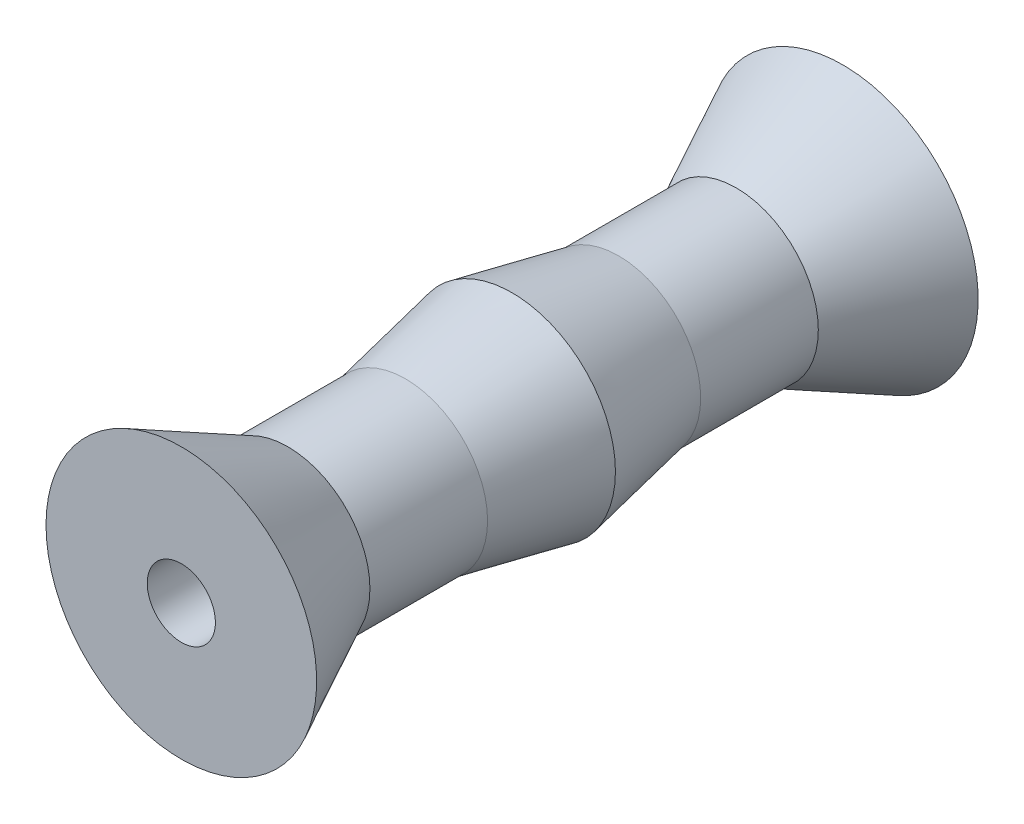
ISO-10303-21;
HEADER;
FILE_DESCRIPTION(('STEP AP214'),'2;1');
FILE_NAME('part.step','',(''),(''),'','','');
FILE_SCHEMA(('AUTOMOTIVE_DESIGN { 1 0 10303 214 1 1 1 1 }'));
ENDSEC;
DATA;
#1=APPLICATION_CONTEXT('core data for automotive mechanical design processes');
#2=APPLICATION_PROTOCOL_DEFINITION('international standard','automotive_design',2000,#1);
#3=PRODUCT_CONTEXT('',#1,'mechanical');
#4=PRODUCT('Part','Part','',(#3));
#5=PRODUCT_RELATED_PRODUCT_CATEGORY('part','',(#4));
#6=PRODUCT_DEFINITION_FORMATION('','',#4);
#7=PRODUCT_DEFINITION_CONTEXT('part definition',#1,'design');
#8=PRODUCT_DEFINITION('design','',#6,#7);
#9=PRODUCT_DEFINITION_SHAPE('','',#8);
#10=(LENGTH_UNIT() NAMED_UNIT(*) SI_UNIT(.MILLI.,.METRE.));
#11=(NAMED_UNIT(*) PLANE_ANGLE_UNIT() SI_UNIT($,.RADIAN.));
#12=(NAMED_UNIT(*) SI_UNIT($,.STERADIAN.) SOLID_ANGLE_UNIT());
#13=UNCERTAINTY_MEASURE_WITH_UNIT(LENGTH_MEASURE(1.E-05),#10,'distance_accuracy_value','');
#14=(GEOMETRIC_REPRESENTATION_CONTEXT(3) GLOBAL_UNCERTAINTY_ASSIGNED_CONTEXT((#13)) GLOBAL_UNIT_ASSIGNED_CONTEXT((#10,
#11,#12)) REPRESENTATION_CONTEXT('',''));
#15=CARTESIAN_POINT('',(0.,0.,0.));
#16=DIRECTION('',(0.,0.,1.));
#17=DIRECTION('',(1.,0.,0.));
#18=AXIS2_PLACEMENT_3D('',#15,#16,#17);
#19=CARTESIAN_POINT('',(0.,0.,19.71));
#20=DIRECTION('',(0.,0.,-1.));
#21=DIRECTION('',(-1.,0.,0.));
#22=AXIS2_PLACEMENT_3D('',#19,#20,#21);
#23=CYLINDRICAL_SURFACE('',#22,4.8895);
#24=CARTESIAN_POINT('',(0.,0.,-13.36));
#25=DIRECTION('',(0.,0.,-1.));
#26=DIRECTION('',(-1.,0.,0.));
#27=AXIS2_PLACEMENT_3D('',#24,#25,#26);
#28=CIRCLE('',#27,4.88950000000001);
#29=CARTESIAN_POINT('',(-4.88950000000001,0.,-13.36));
#30=VERTEX_POINT('',#29);
#31=EDGE_CURVE('E64',#30,#30,#28,.T.);
#32=ORIENTED_EDGE('',*,*,#31,.F.);
#33=EDGE_LOOP('',(#32));
#34=FACE_BOUND('',#33,.T.);
#35=CARTESIAN_POINT('',(0.,0.,-6.35));
#36=DIRECTION('',(0.,0.,-1.));
#37=DIRECTION('',(-1.,0.,0.));
#38=AXIS2_PLACEMENT_3D('',#35,#36,#37);
#39=CIRCLE('',#38,4.88950000000001);
#40=CARTESIAN_POINT('',(-4.88950000000001,0.,-6.35));
#41=VERTEX_POINT('',#40);
#42=EDGE_CURVE('E52',#41,#41,#39,.T.);
#43=ORIENTED_EDGE('',*,*,#42,.T.);
#44=EDGE_LOOP('',(#43));
#45=FACE_BOUND('',#44,.T.);
#46=ADVANCED_FACE('F34',(#34,#45),#23,.T.);
#47=CARTESIAN_POINT('',(0.,0.,19.71));
#48=DIRECTION('',(0.,0.,1.));
#49=DIRECTION('',(1.,0.,0.));
#50=AXIS2_PLACEMENT_3D('',#47,#48,#49);
#51=PLANE('',#50);
#52=CARTESIAN_POINT('',(0.,0.,19.71));
#53=DIRECTION('',(0.,0.,1.));
#54=DIRECTION('',(1.,0.,0.));
#55=AXIS2_PLACEMENT_3D('',#52,#53,#54);
#56=CIRCLE('',#55,2.032);
#57=CARTESIAN_POINT('',(2.032,0.,19.71));
#58=VERTEX_POINT('',#57);
#59=EDGE_CURVE('E10',#58,#58,#56,.T.);
#60=ORIENTED_EDGE('',*,*,#59,.F.);
#61=EDGE_LOOP('',(#60));
#62=FACE_BOUND('',#61,.T.);
#63=CARTESIAN_POINT('',(0.,0.,19.71));
#64=DIRECTION('',(0.,0.,-1.));
#65=DIRECTION('',(-1.,0.,0.));
#66=AXIS2_PLACEMENT_3D('',#63,#64,#65);
#67=CIRCLE('',#66,8.0645);
#68=CARTESIAN_POINT('',(-8.0645,0.,19.71));
#69=VERTEX_POINT('',#68);
#70=EDGE_CURVE('E45',#69,#69,#67,.T.);
#71=ORIENTED_EDGE('',*,*,#70,.F.);
#72=EDGE_LOOP('',(#71));
#73=FACE_BOUND('',#72,.T.);
#74=ADVANCED_FACE('F73',(#62,#73),#51,.T.);
#75=CARTESIAN_POINT('',(0.,0.,-19.71));
#76=DIRECTION('',(0.,0.,1.));
#77=DIRECTION('',(1.,0.,0.));
#78=AXIS2_PLACEMENT_3D('',#75,#76,#77);
#79=PLANE('',#78);
#80=CARTESIAN_POINT('',(0.,0.,-19.71));
#81=DIRECTION('',(0.,0.,1.));
#82=DIRECTION('',(1.,0.,0.));
#83=AXIS2_PLACEMENT_3D('',#80,#81,#82);
#84=CIRCLE('',#83,2.032);
#85=CARTESIAN_POINT('',(2.032,0.,-19.71));
#86=VERTEX_POINT('',#85);
#87=EDGE_CURVE('E38',#86,#86,#84,.T.);
#88=ORIENTED_EDGE('',*,*,#87,.T.);
#89=EDGE_LOOP('',(#88));
#90=FACE_BOUND('',#89,.T.);
#91=CARTESIAN_POINT('',(0.,0.,-19.71));
#92=DIRECTION('',(0.,0.,-1.));
#93=DIRECTION('',(-1.,0.,0.));
#94=AXIS2_PLACEMENT_3D('',#91,#92,#93);
#95=CIRCLE('',#94,8.0645);
#96=CARTESIAN_POINT('',(-8.0645,0.,-19.71));
#97=VERTEX_POINT('',#96);
#98=EDGE_CURVE('E61',#97,#97,#95,.T.);
#99=ORIENTED_EDGE('',*,*,#98,.T.);
#100=EDGE_LOOP('',(#99));
#101=FACE_BOUND('',#100,.T.);
#102=ADVANCED_FACE('F96',(#90,#101),#79,.F.);
#103=CARTESIAN_POINT('',(0.,0.,6.35));
#104=DIRECTION('',(0.,0.,-1.));
#105=DIRECTION('',(-1.,0.,0.));
#106=AXIS2_PLACEMENT_3D('',#103,#104,#105);
#107=CIRCLE('',#106,4.8895);
#108=CARTESIAN_POINT('',(-4.8895,0.,6.35));
#109=VERTEX_POINT('',#108);
#110=EDGE_CURVE('E58',#109,#109,#107,.T.);
#111=ORIENTED_EDGE('',*,*,#110,.F.);
#112=EDGE_LOOP('',(#111));
#113=FACE_BOUND('',#112,.T.);
#114=CARTESIAN_POINT('',(0.,0.,13.36));
#115=DIRECTION('',(0.,0.,-1.));
#116=DIRECTION('',(-1.,0.,0.));
#117=AXIS2_PLACEMENT_3D('',#114,#115,#116);
#118=CIRCLE('',#117,4.8895);
#119=CARTESIAN_POINT('',(-4.8895,0.,13.36));
#120=VERTEX_POINT('',#119);
#121=EDGE_CURVE('E49',#120,#120,#118,.T.);
#122=ORIENTED_EDGE('',*,*,#121,.T.);
#123=EDGE_LOOP('',(#122));
#124=FACE_BOUND('',#123,.T.);
#125=ADVANCED_FACE('F36',(#113,#124),#23,.T.);
#126=CARTESIAN_POINT('',(0.,0.,19.71));
#127=DIRECTION('',(0.,0.,-1.));
#128=DIRECTION('',(-1.,0.,0.));
#129=AXIS2_PLACEMENT_3D('',#126,#127,#128);
#130=CYLINDRICAL_SURFACE('',#129,2.032);
#131=ORIENTED_EDGE('',*,*,#59,.T.);
#132=EDGE_LOOP('',(#131));
#133=FACE_BOUND('',#132,.T.);
#134=ORIENTED_EDGE('',*,*,#87,.F.);
#135=EDGE_LOOP('',(#134));
#136=FACE_BOUND('',#135,.T.);
#137=ADVANCED_FACE('F88',(#133,#136),#130,.F.);
#138=CARTESIAN_POINT('',(0.,0.,13.36));
#139=DIRECTION('',(0.,0.,1.));
#140=DIRECTION('',(1.,0.,0.));
#141=AXIS2_PLACEMENT_3D('',#138,#139,#140);
#142=CONICAL_SURFACE('',#141,4.8895,0.463647609000806);
#143=ORIENTED_EDGE('',*,*,#70,.T.);
#144=EDGE_LOOP('',(#143));
#145=FACE_BOUND('',#144,.T.);
#146=ORIENTED_EDGE('',*,*,#121,.F.);
#147=EDGE_LOOP('',(#146));
#148=FACE_BOUND('',#147,.T.);
#149=ADVANCED_FACE('F79',(#145,#148),#142,.T.);
#150=CARTESIAN_POINT('',(0.,0.,-6.35));
#151=DIRECTION('',(0.,0.,1.));
#152=DIRECTION('',(1.,0.,0.));
#153=AXIS2_PLACEMENT_3D('',#150,#151,#152);
#154=CONICAL_SURFACE('',#153,4.88950000000001,0.19739555984988);
#155=CARTESIAN_POINT('',(0.,0.,0.));
#156=DIRECTION('',(0.,0.,-1.));
#157=DIRECTION('',(-1.,0.,0.));
#158=AXIS2_PLACEMENT_3D('',#155,#156,#157);
#159=CIRCLE('',#158,6.1595);
#160=CARTESIAN_POINT('',(-6.1595,0.,0.));
#161=VERTEX_POINT('',#160);
#162=EDGE_CURVE('E55',#161,#161,#159,.T.);
#163=ORIENTED_EDGE('',*,*,#162,.T.);
#164=EDGE_LOOP('',(#163));
#165=FACE_BOUND('',#164,.T.);
#166=ORIENTED_EDGE('',*,*,#42,.F.);
#167=EDGE_LOOP('',(#166));
#168=FACE_BOUND('',#167,.T.);
#169=ADVANCED_FACE('F76',(#165,#168),#154,.T.);
#170=CARTESIAN_POINT('',(0.,0.,0.));
#171=DIRECTION('',(0.,0.,-1.));
#172=DIRECTION('',(-1.,0.,0.));
#173=AXIS2_PLACEMENT_3D('',#170,#171,#172);
#174=CONICAL_SURFACE('',#173,6.1595,0.197395559849881);
#175=ORIENTED_EDGE('',*,*,#110,.T.);
#176=EDGE_LOOP('',(#175));
#177=FACE_BOUND('',#176,.T.);
#178=ORIENTED_EDGE('',*,*,#162,.F.);
#179=EDGE_LOOP('',(#178));
#180=FACE_BOUND('',#179,.T.);
#181=ADVANCED_FACE('F78',(#177,#180),#174,.T.);
#182=CARTESIAN_POINT('',(0.,0.,-19.71));
#183=DIRECTION('',(0.,0.,-1.));
#184=DIRECTION('',(-1.,0.,0.));
#185=AXIS2_PLACEMENT_3D('',#182,#183,#184);
#186=CONICAL_SURFACE('',#185,8.0645,0.463647609000806);
#187=ORIENTED_EDGE('',*,*,#31,.T.);
#188=EDGE_LOOP('',(#187));
#189=FACE_BOUND('',#188,.T.);
#190=ORIENTED_EDGE('',*,*,#98,.F.);
#191=EDGE_LOOP('',(#190));
#192=FACE_BOUND('',#191,.T.);
#193=ADVANCED_FACE('F68',(#189,#192),#186,.T.);
#194=CLOSED_SHELL('',(#46,#74,#102,#125,#137,#149,#169,#181,#193));
#195=MANIFOLD_SOLID_BREP('B2',#194);
#196=ADVANCED_BREP_SHAPE_REPRESENTATION('',(#18,#195),#14);
#197=SHAPE_DEFINITION_REPRESENTATION(#9,#196);
ENDSEC;
END-ISO-10303-21;
